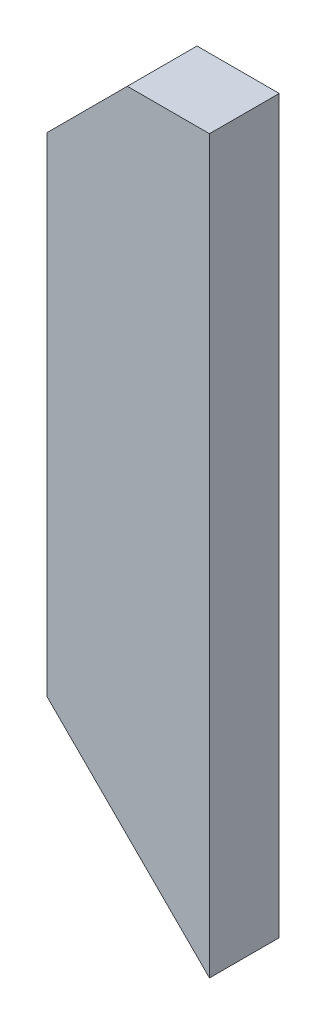
ISO-10303-21;
HEADER;
FILE_DESCRIPTION(('STEP AP214'),'2;1');
FILE_NAME('part.step','',(''),(''),'','','');
FILE_SCHEMA(('AUTOMOTIVE_DESIGN { 1 0 10303 214 1 1 1 1 }'));
ENDSEC;
DATA;
#1=APPLICATION_CONTEXT('core data for automotive mechanical design processes');
#2=APPLICATION_PROTOCOL_DEFINITION('international standard','automotive_design',2000,#1);
#3=PRODUCT_CONTEXT('',#1,'mechanical');
#4=PRODUCT('Part','Part','',(#3));
#5=PRODUCT_RELATED_PRODUCT_CATEGORY('part','',(#4));
#6=PRODUCT_DEFINITION_FORMATION('','',#4);
#7=PRODUCT_DEFINITION_CONTEXT('part definition',#1,'design');
#8=PRODUCT_DEFINITION('design','',#6,#7);
#9=PRODUCT_DEFINITION_SHAPE('','',#8);
#10=(LENGTH_UNIT() NAMED_UNIT(*) SI_UNIT(.MILLI.,.METRE.));
#11=(NAMED_UNIT(*) PLANE_ANGLE_UNIT() SI_UNIT($,.RADIAN.));
#12=(NAMED_UNIT(*) SI_UNIT($,.STERADIAN.) SOLID_ANGLE_UNIT());
#13=UNCERTAINTY_MEASURE_WITH_UNIT(LENGTH_MEASURE(1.E-05),#10,'distance_accuracy_value','');
#14=(GEOMETRIC_REPRESENTATION_CONTEXT(3) GLOBAL_UNCERTAINTY_ASSIGNED_CONTEXT((#13)) GLOBAL_UNIT_ASSIGNED_CONTEXT((#10,
#11,#12)) REPRESENTATION_CONTEXT('',''));
#15=CARTESIAN_POINT('',(0.,0.,0.));
#16=DIRECTION('',(0.,0.,1.));
#17=DIRECTION('',(1.,0.,0.));
#18=AXIS2_PLACEMENT_3D('',#15,#16,#17);
#19=CARTESIAN_POINT('',(44.45,444.5,19.05));
#20=DIRECTION('',(-1.,0.,0.));
#21=DIRECTION('',(0.,0.,1.));
#22=AXIS2_PLACEMENT_3D('',#19,#20,#21);
#23=PLANE('',#22);
#24=DIRECTION('',(0.,-1.,0.));
#25=VECTOR('',#24,1.);
#26=CARTESIAN_POINT('',(44.45,444.5,-19.05));
#27=LINE('',#26,#25);
#28=CARTESIAN_POINT('',(44.45,399.598719394654,-19.05));
#29=VERTEX_POINT('',#28);
#30=CARTESIAN_POINT('',(44.45,0.,-19.05));
#31=VERTEX_POINT('',#30);
#32=EDGE_CURVE('E11',#29,#31,#27,.T.);
#33=ORIENTED_EDGE('',*,*,#32,.F.);
#34=DIRECTION('',(0.,0.,1.));
#35=VECTOR('',#34,1.);
#36=CARTESIAN_POINT('',(44.45,399.598719394654,-19.05));
#37=LINE('',#36,#35);
#38=CARTESIAN_POINT('',(44.45,399.598719394654,19.05));
#39=VERTEX_POINT('',#38);
#40=EDGE_CURVE('E81',#29,#39,#37,.T.);
#41=ORIENTED_EDGE('',*,*,#40,.T.);
#42=DIRECTION('',(0.,-1.,0.));
#43=VECTOR('',#42,1.);
#44=CARTESIAN_POINT('',(44.45,444.5,19.05));
#45=LINE('',#44,#43);
#46=CARTESIAN_POINT('',(44.45,0.,19.05));
#47=VERTEX_POINT('',#46);
#48=EDGE_CURVE('E98',#39,#47,#45,.T.);
#49=ORIENTED_EDGE('',*,*,#48,.T.);
#50=DIRECTION('',(0.,0.,-1.));
#51=VECTOR('',#50,1.);
#52=CARTESIAN_POINT('',(44.45,0.,19.05));
#53=LINE('',#52,#51);
#54=EDGE_CURVE('E97',#47,#31,#53,.T.);
#55=ORIENTED_EDGE('',*,*,#54,.T.);
#56=EDGE_LOOP('',(#33,#41,#49,#55));
#57=FACE_BOUND('',#56,.T.);
#58=ADVANCED_FACE('F38',(#57),#23,.F.);
#59=CARTESIAN_POINT('',(-44.45,444.5,-19.05));
#60=DIRECTION('',(0.,0.,1.));
#61=DIRECTION('',(1.,0.,0.));
#62=AXIS2_PLACEMENT_3D('',#59,#60,#61);
#63=PLANE('',#62);
#64=DIRECTION('',(0.707106781186543,0.707106781186551,0.));
#65=VECTOR('',#64,1.);
#66=CARTESIAN_POINT('',(44.45,444.5,-19.05));
#67=LINE('',#66,#65);
#68=CARTESIAN_POINT('',(-44.45,355.599999999999,-19.05));
#69=VERTEX_POINT('',#68);
#70=CARTESIAN_POINT('',(-0.451280605345265,399.598719394654,-19.05));
#71=VERTEX_POINT('',#70);
#72=EDGE_CURVE('E93',#69,#71,#67,.T.);
#73=ORIENTED_EDGE('',*,*,#72,.T.);
#74=DIRECTION('',(1.,0.,0.));
#75=VECTOR('',#74,1.);
#76=CARTESIAN_POINT('',(-0.4512806053453,399.598719394654,-19.05));
#77=LINE('',#76,#75);
#78=EDGE_CURVE('E52',#71,#29,#77,.T.);
#79=ORIENTED_EDGE('',*,*,#78,.T.);
#80=ORIENTED_EDGE('',*,*,#32,.T.);
#81=DIRECTION('',(-0.707106781186544,0.707106781186551,0.));
#82=VECTOR('',#81,1.);
#83=CARTESIAN_POINT('',(-44.45,88.9000000000009,-19.05));
#84=LINE('',#83,#82);
#85=CARTESIAN_POINT('',(-44.45,88.9000000000009,-19.05));
#86=VERTEX_POINT('',#85);
#87=EDGE_CURVE('E117',#31,#86,#84,.T.);
#88=ORIENTED_EDGE('',*,*,#87,.T.);
#89=DIRECTION('',(0.,-1.,0.));
#90=VECTOR('',#89,1.);
#91=CARTESIAN_POINT('',(-44.45,444.5,-19.05));
#92=LINE('',#91,#90);
#93=EDGE_CURVE('E45',#69,#86,#92,.T.);
#94=ORIENTED_EDGE('',*,*,#93,.F.);
#95=EDGE_LOOP('',(#73,#79,#80,#88,#94));
#96=FACE_BOUND('',#95,.T.);
#97=ADVANCED_FACE('F91',(#96),#63,.F.);
#98=CARTESIAN_POINT('',(-44.45,444.5,19.05));
#99=DIRECTION('',(1.,0.,0.));
#100=DIRECTION('',(0.,0.,-1.));
#101=AXIS2_PLACEMENT_3D('',#98,#99,#100);
#102=PLANE('',#101);
#103=DIRECTION('',(0.,-1.,0.));
#104=VECTOR('',#103,1.);
#105=CARTESIAN_POINT('',(-44.45,444.5,19.05));
#106=LINE('',#105,#104);
#107=CARTESIAN_POINT('',(-44.45,355.599999999999,19.05));
#108=VERTEX_POINT('',#107);
#109=CARTESIAN_POINT('',(-44.45,88.9000000000009,19.05));
#110=VERTEX_POINT('',#109);
#111=EDGE_CURVE('E103',#108,#110,#106,.T.);
#112=ORIENTED_EDGE('',*,*,#111,.F.);
#113=DIRECTION('',(0.,0.,1.));
#114=VECTOR('',#113,1.);
#115=CARTESIAN_POINT('',(-44.45,355.599999999999,-19.05));
#116=LINE('',#115,#114);
#117=EDGE_CURVE('E101',#69,#108,#116,.T.);
#118=ORIENTED_EDGE('',*,*,#117,.F.);
#119=ORIENTED_EDGE('',*,*,#93,.T.);
#120=DIRECTION('',(0.,0.,1.));
#121=VECTOR('',#120,1.);
#122=CARTESIAN_POINT('',(-44.45,88.9000000000009,-19.05));
#123=LINE('',#122,#121);
#124=EDGE_CURVE('E107',#86,#110,#123,.T.);
#125=ORIENTED_EDGE('',*,*,#124,.T.);
#126=EDGE_LOOP('',(#112,#118,#119,#125));
#127=FACE_BOUND('',#126,.T.);
#128=ADVANCED_FACE('F116',(#127),#102,.F.);
#129=CARTESIAN_POINT('',(-44.45,444.5,19.05));
#130=DIRECTION('',(0.,0.,-1.));
#131=DIRECTION('',(-1.,0.,0.));
#132=AXIS2_PLACEMENT_3D('',#129,#130,#131);
#133=PLANE('',#132);
#134=ORIENTED_EDGE('',*,*,#48,.F.);
#135=DIRECTION('',(1.,0.,0.));
#136=VECTOR('',#135,1.);
#137=CARTESIAN_POINT('',(-0.4512806053453,399.598719394654,19.05));
#138=LINE('',#137,#136);
#139=CARTESIAN_POINT('',(-0.4512806053453,399.598719394654,19.05));
#140=VERTEX_POINT('',#139);
#141=EDGE_CURVE('E84',#140,#39,#138,.T.);
#142=ORIENTED_EDGE('',*,*,#141,.F.);
#143=DIRECTION('',(0.707106781186543,0.707106781186551,0.));
#144=VECTOR('',#143,1.);
#145=CARTESIAN_POINT('',(44.45,444.5,19.05));
#146=LINE('',#145,#144);
#147=EDGE_CURVE('E119',#108,#140,#146,.T.);
#148=ORIENTED_EDGE('',*,*,#147,.F.);
#149=ORIENTED_EDGE('',*,*,#111,.T.);
#150=DIRECTION('',(-0.707106781186544,0.707106781186551,0.));
#151=VECTOR('',#150,1.);
#152=CARTESIAN_POINT('',(-44.45,88.9000000000009,19.05));
#153=LINE('',#152,#151);
#154=EDGE_CURVE('E87',#47,#110,#153,.T.);
#155=ORIENTED_EDGE('',*,*,#154,.F.);
#156=EDGE_LOOP('',(#134,#142,#148,#149,#155));
#157=FACE_BOUND('',#156,.T.);
#158=ADVANCED_FACE('F128',(#157),#133,.F.);
#159=CARTESIAN_POINT('',(-44.45,88.9000000000009,-19.05));
#160=DIRECTION('',(0.707106781186551,0.707106781186544,0.));
#161=DIRECTION('',(-0.707106781186544,0.707106781186551,0.));
#162=AXIS2_PLACEMENT_3D('',#159,#160,#161);
#163=PLANE('',#162);
#164=ORIENTED_EDGE('',*,*,#154,.T.);
#165=ORIENTED_EDGE('',*,*,#124,.F.);
#166=ORIENTED_EDGE('',*,*,#87,.F.);
#167=ORIENTED_EDGE('',*,*,#54,.F.);
#168=EDGE_LOOP('',(#164,#165,#166,#167));
#169=FACE_BOUND('',#168,.T.);
#170=ADVANCED_FACE('F131',(#169),#163,.F.);
#171=CARTESIAN_POINT('',(44.45,444.5,-19.05));
#172=DIRECTION('',(0.707106781186551,-0.707106781186544,0.));
#173=DIRECTION('',(0.707106781186544,0.707106781186551,0.));
#174=AXIS2_PLACEMENT_3D('',#171,#172,#173);
#175=PLANE('',#174);
#176=ORIENTED_EDGE('',*,*,#147,.T.);
#177=DIRECTION('',(0.,0.,1.));
#178=VECTOR('',#177,1.);
#179=CARTESIAN_POINT('',(-0.4512806053453,399.598719394654,-19.05));
#180=LINE('',#179,#178);
#181=EDGE_CURVE('E88',#71,#140,#180,.T.);
#182=ORIENTED_EDGE('',*,*,#181,.F.);
#183=ORIENTED_EDGE('',*,*,#72,.F.);
#184=ORIENTED_EDGE('',*,*,#117,.T.);
#185=EDGE_LOOP('',(#176,#182,#183,#184));
#186=FACE_BOUND('',#185,.T.);
#187=ADVANCED_FACE('F129',(#186),#175,.F.);
#188=CARTESIAN_POINT('',(-0.4512806053453,399.598719394654,-19.05));
#189=DIRECTION('',(0.,-1.,0.));
#190=DIRECTION('',(0.,0.,-1.));
#191=AXIS2_PLACEMENT_3D('',#188,#189,#190);
#192=PLANE('',#191);
#193=ORIENTED_EDGE('',*,*,#141,.T.);
#194=ORIENTED_EDGE('',*,*,#40,.F.);
#195=ORIENTED_EDGE('',*,*,#78,.F.);
#196=ORIENTED_EDGE('',*,*,#181,.T.);
#197=EDGE_LOOP('',(#193,#194,#195,#196));
#198=FACE_BOUND('',#197,.T.);
#199=ADVANCED_FACE('F82',(#198),#192,.F.);
#200=CLOSED_SHELL('',(#58,#97,#128,#158,#170,#187,#199));
#201=MANIFOLD_SOLID_BREP('B2',#200);
#202=ADVANCED_BREP_SHAPE_REPRESENTATION('',(#18,#201),#14);
#203=SHAPE_DEFINITION_REPRESENTATION(#9,#202);
ENDSEC;
END-ISO-10303-21;
